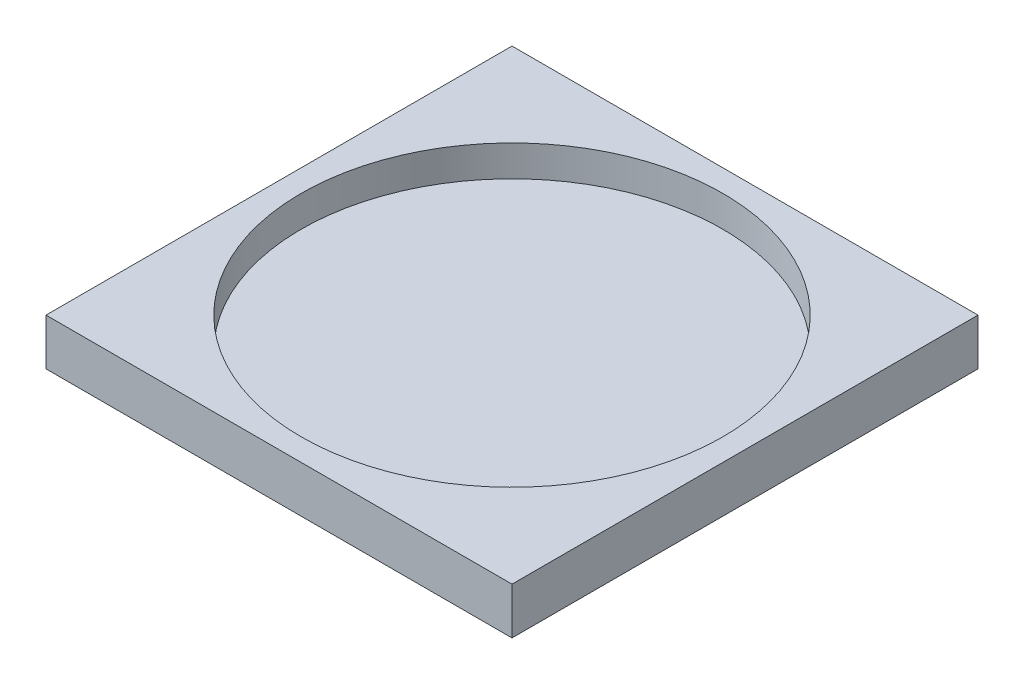
ISO-10303-21;
HEADER;
FILE_DESCRIPTION(('STEP AP214'),'2;1');
FILE_NAME('part.step','',(''),(''),'','','');
FILE_SCHEMA(('AUTOMOTIVE_DESIGN { 1 0 10303 214 1 1 1 1 }'));
ENDSEC;
DATA;
#1=APPLICATION_CONTEXT('core data for automotive mechanical design processes');
#2=APPLICATION_PROTOCOL_DEFINITION('international standard','automotive_design',2000,#1);
#3=PRODUCT_CONTEXT('',#1,'mechanical');
#4=PRODUCT('Part','Part','',(#3));
#5=PRODUCT_RELATED_PRODUCT_CATEGORY('part','',(#4));
#6=PRODUCT_DEFINITION_FORMATION('','',#4);
#7=PRODUCT_DEFINITION_CONTEXT('part definition',#1,'design');
#8=PRODUCT_DEFINITION('design','',#6,#7);
#9=PRODUCT_DEFINITION_SHAPE('','',#8);
#10=(LENGTH_UNIT() NAMED_UNIT(*) SI_UNIT(.MILLI.,.METRE.));
#11=(NAMED_UNIT(*) PLANE_ANGLE_UNIT() SI_UNIT($,.RADIAN.));
#12=(NAMED_UNIT(*) SI_UNIT($,.STERADIAN.) SOLID_ANGLE_UNIT());
#13=UNCERTAINTY_MEASURE_WITH_UNIT(LENGTH_MEASURE(1.E-05),#10,'distance_accuracy_value','');
#14=(GEOMETRIC_REPRESENTATION_CONTEXT(3) GLOBAL_UNCERTAINTY_ASSIGNED_CONTEXT((#13)) GLOBAL_UNIT_ASSIGNED_CONTEXT((#10,
#11,#12)) REPRESENTATION_CONTEXT('',''));
#15=CARTESIAN_POINT('',(0.,0.,0.));
#16=DIRECTION('',(0.,0.,1.));
#17=DIRECTION('',(1.,0.,0.));
#18=AXIS2_PLACEMENT_3D('',#15,#16,#17);
#19=CARTESIAN_POINT('',(15.,3.,15.));
#20=DIRECTION('',(-1.,0.,0.));
#21=DIRECTION('',(0.,0.,1.));
#22=AXIS2_PLACEMENT_3D('',#19,#20,#21);
#23=PLANE('',#22);
#24=DIRECTION('',(0.,0.,-1.));
#25=VECTOR('',#24,1.);
#26=CARTESIAN_POINT('',(15.,0.,15.));
#27=LINE('',#26,#25);
#28=CARTESIAN_POINT('',(15.,0.,15.));
#29=VERTEX_POINT('',#28);
#30=CARTESIAN_POINT('',(15.,0.,-15.));
#31=VERTEX_POINT('',#30);
#32=EDGE_CURVE('E95',#29,#31,#27,.T.);
#33=ORIENTED_EDGE('',*,*,#32,.T.);
#34=DIRECTION('',(0.,-1.,0.));
#35=VECTOR('',#34,1.);
#36=CARTESIAN_POINT('',(15.,3.,-15.));
#37=LINE('',#36,#35);
#38=CARTESIAN_POINT('',(15.,3.,-15.));
#39=VERTEX_POINT('',#38);
#40=EDGE_CURVE('E11',#39,#31,#37,.T.);
#41=ORIENTED_EDGE('',*,*,#40,.F.);
#42=DIRECTION('',(0.,0.,-1.));
#43=VECTOR('',#42,1.);
#44=CARTESIAN_POINT('',(15.,3.,15.));
#45=LINE('',#44,#43);
#46=CARTESIAN_POINT('',(15.,3.,15.));
#47=VERTEX_POINT('',#46);
#48=EDGE_CURVE('E83',#47,#39,#45,.T.);
#49=ORIENTED_EDGE('',*,*,#48,.F.);
#50=DIRECTION('',(0.,-1.,0.));
#51=VECTOR('',#50,1.);
#52=CARTESIAN_POINT('',(15.,3.,15.));
#53=LINE('',#52,#51);
#54=EDGE_CURVE('E91',#47,#29,#53,.T.);
#55=ORIENTED_EDGE('',*,*,#54,.T.);
#56=EDGE_LOOP('',(#33,#41,#49,#55));
#57=FACE_BOUND('',#56,.T.);
#58=ADVANCED_FACE('F32',(#57),#23,.F.);
#59=CARTESIAN_POINT('',(-15.,3.,-15.));
#60=DIRECTION('',(0.,0.,1.));
#61=DIRECTION('',(1.,0.,0.));
#62=AXIS2_PLACEMENT_3D('',#59,#60,#61);
#63=PLANE('',#62);
#64=DIRECTION('',(-1.,0.,0.));
#65=VECTOR('',#64,1.);
#66=CARTESIAN_POINT('',(-15.,0.,-15.));
#67=LINE('',#66,#65);
#68=CARTESIAN_POINT('',(-15.,0.,-15.));
#69=VERTEX_POINT('',#68);
#70=EDGE_CURVE('E87',#31,#69,#67,.T.);
#71=ORIENTED_EDGE('',*,*,#70,.T.);
#72=DIRECTION('',(0.,-1.,0.));
#73=VECTOR('',#72,1.);
#74=CARTESIAN_POINT('',(-15.,3.,-15.));
#75=LINE('',#74,#73);
#76=CARTESIAN_POINT('',(-15.,3.,-15.));
#77=VERTEX_POINT('',#76);
#78=EDGE_CURVE('E40',#77,#69,#75,.T.);
#79=ORIENTED_EDGE('',*,*,#78,.F.);
#80=DIRECTION('',(-1.,0.,0.));
#81=VECTOR('',#80,1.);
#82=CARTESIAN_POINT('',(-15.,3.,-15.));
#83=LINE('',#82,#81);
#84=EDGE_CURVE('E78',#39,#77,#83,.T.);
#85=ORIENTED_EDGE('',*,*,#84,.F.);
#86=ORIENTED_EDGE('',*,*,#40,.T.);
#87=EDGE_LOOP('',(#71,#79,#85,#86));
#88=FACE_BOUND('',#87,.T.);
#89=ADVANCED_FACE('F86',(#88),#63,.F.);
#90=CARTESIAN_POINT('',(-15.,3.,15.));
#91=DIRECTION('',(1.,0.,0.));
#92=DIRECTION('',(0.,0.,-1.));
#93=AXIS2_PLACEMENT_3D('',#90,#91,#92);
#94=PLANE('',#93);
#95=DIRECTION('',(0.,0.,1.));
#96=VECTOR('',#95,1.);
#97=CARTESIAN_POINT('',(-15.,0.,15.));
#98=LINE('',#97,#96);
#99=CARTESIAN_POINT('',(-15.,0.,15.));
#100=VERTEX_POINT('',#99);
#101=EDGE_CURVE('E65',#69,#100,#98,.T.);
#102=ORIENTED_EDGE('',*,*,#101,.T.);
#103=DIRECTION('',(0.,-1.,0.));
#104=VECTOR('',#103,1.);
#105=CARTESIAN_POINT('',(-15.,3.,15.));
#106=LINE('',#105,#104);
#107=CARTESIAN_POINT('',(-15.,3.,15.));
#108=VERTEX_POINT('',#107);
#109=EDGE_CURVE('E88',#108,#100,#106,.T.);
#110=ORIENTED_EDGE('',*,*,#109,.F.);
#111=DIRECTION('',(0.,0.,1.));
#112=VECTOR('',#111,1.);
#113=CARTESIAN_POINT('',(-15.,3.,15.));
#114=LINE('',#113,#112);
#115=EDGE_CURVE('E81',#77,#108,#114,.T.);
#116=ORIENTED_EDGE('',*,*,#115,.F.);
#117=ORIENTED_EDGE('',*,*,#78,.T.);
#118=EDGE_LOOP('',(#102,#110,#116,#117));
#119=FACE_BOUND('',#118,.T.);
#120=ADVANCED_FACE('F89',(#119),#94,.F.);
#121=CARTESIAN_POINT('',(-15.,3.,15.));
#122=DIRECTION('',(0.,0.,-1.));
#123=DIRECTION('',(-1.,0.,0.));
#124=AXIS2_PLACEMENT_3D('',#121,#122,#123);
#125=PLANE('',#124);
#126=DIRECTION('',(1.,0.,0.));
#127=VECTOR('',#126,1.);
#128=CARTESIAN_POINT('',(-15.,0.,15.));
#129=LINE('',#128,#127);
#130=EDGE_CURVE('E71',#100,#29,#129,.T.);
#131=ORIENTED_EDGE('',*,*,#130,.T.);
#132=ORIENTED_EDGE('',*,*,#54,.F.);
#133=DIRECTION('',(1.,0.,0.));
#134=VECTOR('',#133,1.);
#135=CARTESIAN_POINT('',(-15.,3.,15.));
#136=LINE('',#135,#134);
#137=EDGE_CURVE('E48',#108,#47,#136,.T.);
#138=ORIENTED_EDGE('',*,*,#137,.F.);
#139=ORIENTED_EDGE('',*,*,#109,.T.);
#140=EDGE_LOOP('',(#131,#132,#138,#139));
#141=FACE_BOUND('',#140,.T.);
#142=ADVANCED_FACE('F103',(#141),#125,.F.);
#143=CARTESIAN_POINT('',(0.,3.,0.));
#144=DIRECTION('',(0.,-1.,0.));
#145=DIRECTION('',(0.,0.,-1.));
#146=AXIS2_PLACEMENT_3D('',#143,#144,#145);
#147=PLANE('',#146);
#148=CARTESIAN_POINT('',(0.,3.,0.));
#149=DIRECTION('',(0.,1.,0.));
#150=DIRECTION('',(0.,0.,1.));
#151=AXIS2_PLACEMENT_3D('',#148,#149,#150);
#152=CIRCLE('',#151,13.575);
#153=CARTESIAN_POINT('',(0.,3.,13.575));
#154=VERTEX_POINT('',#153);
#155=EDGE_CURVE('E109',#154,#154,#152,.T.);
#156=ORIENTED_EDGE('',*,*,#155,.F.);
#157=EDGE_LOOP('',(#156));
#158=FACE_BOUND('',#157,.T.);
#159=ORIENTED_EDGE('',*,*,#48,.T.);
#160=ORIENTED_EDGE('',*,*,#84,.T.);
#161=ORIENTED_EDGE('',*,*,#115,.T.);
#162=ORIENTED_EDGE('',*,*,#137,.T.);
#163=EDGE_LOOP('',(#159,#160,#161,#162));
#164=FACE_BOUND('',#163,.T.);
#165=ADVANCED_FACE('F79',(#158,#164),#147,.F.);
#166=CARTESIAN_POINT('',(0.,0.,0.));
#167=DIRECTION('',(0.,-1.,0.));
#168=DIRECTION('',(0.,0.,-1.));
#169=AXIS2_PLACEMENT_3D('',#166,#167,#168);
#170=PLANE('',#169);
#171=ORIENTED_EDGE('',*,*,#32,.F.);
#172=ORIENTED_EDGE('',*,*,#130,.F.);
#173=ORIENTED_EDGE('',*,*,#101,.F.);
#174=ORIENTED_EDGE('',*,*,#70,.F.);
#175=EDGE_LOOP('',(#171,#172,#173,#174));
#176=FACE_BOUND('',#175,.T.);
#177=ADVANCED_FACE('F106',(#176),#170,.T.);
#178=CARTESIAN_POINT('',(0.,1.,0.));
#179=DIRECTION('',(0.,1.,0.));
#180=DIRECTION('',(0.,0.,1.));
#181=AXIS2_PLACEMENT_3D('',#178,#179,#180);
#182=CYLINDRICAL_SURFACE('',#181,13.575);
#183=CARTESIAN_POINT('',(0.,1.,0.));
#184=DIRECTION('',(0.,1.,0.));
#185=DIRECTION('',(0.,0.,1.));
#186=AXIS2_PLACEMENT_3D('',#183,#184,#185);
#187=CIRCLE('',#186,13.575);
#188=CARTESIAN_POINT('',(0.,1.,13.575));
#189=VERTEX_POINT('',#188);
#190=EDGE_CURVE('E98',#189,#189,#187,.T.);
#191=ORIENTED_EDGE('',*,*,#190,.F.);
#192=EDGE_LOOP('',(#191));
#193=FACE_BOUND('',#192,.T.);
#194=ORIENTED_EDGE('',*,*,#155,.T.);
#195=EDGE_LOOP('',(#194));
#196=FACE_BOUND('',#195,.T.);
#197=ADVANCED_FACE('F117',(#193,#196),#182,.F.);
#198=CARTESIAN_POINT('',(0.,1.,0.));
#199=DIRECTION('',(0.,1.,0.));
#200=DIRECTION('',(0.,0.,1.));
#201=AXIS2_PLACEMENT_3D('',#198,#199,#200);
#202=PLANE('',#201);
#203=ORIENTED_EDGE('',*,*,#190,.T.);
#204=EDGE_LOOP('',(#203));
#205=FACE_BOUND('',#204,.T.);
#206=ADVANCED_FACE('F115',(#205),#202,.T.);
#207=CLOSED_SHELL('',(#58,#89,#120,#142,#165,#177,#197,#206));
#208=MANIFOLD_SOLID_BREP('B2',#207);
#209=ADVANCED_BREP_SHAPE_REPRESENTATION('',(#18,#208),#14);
#210=SHAPE_DEFINITION_REPRESENTATION(#9,#209);
ENDSEC;
END-ISO-10303-21;
